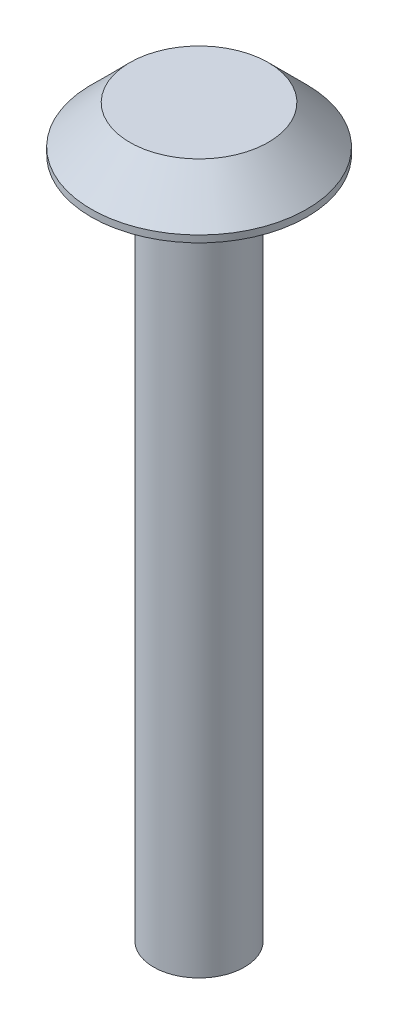
ISO-10303-21;
HEADER;
FILE_DESCRIPTION(('STEP AP214'),'2;1');
FILE_NAME('part.step','',(''),(''),'','','');
FILE_SCHEMA(('AUTOMOTIVE_DESIGN { 1 0 10303 214 1 1 1 1 }'));
ENDSEC;
DATA;
#1=APPLICATION_CONTEXT('core data for automotive mechanical design processes');
#2=APPLICATION_PROTOCOL_DEFINITION('international standard','automotive_design',2000,#1);
#3=PRODUCT_CONTEXT('',#1,'mechanical');
#4=PRODUCT('Part','Part','',(#3));
#5=PRODUCT_RELATED_PRODUCT_CATEGORY('part','',(#4));
#6=PRODUCT_DEFINITION_FORMATION('','',#4);
#7=PRODUCT_DEFINITION_CONTEXT('part definition',#1,'design');
#8=PRODUCT_DEFINITION('design','',#6,#7);
#9=PRODUCT_DEFINITION_SHAPE('','',#8);
#10=(LENGTH_UNIT() NAMED_UNIT(*) SI_UNIT(.MILLI.,.METRE.));
#11=(NAMED_UNIT(*) PLANE_ANGLE_UNIT() SI_UNIT($,.RADIAN.));
#12=(NAMED_UNIT(*) SI_UNIT($,.STERADIAN.) SOLID_ANGLE_UNIT());
#13=UNCERTAINTY_MEASURE_WITH_UNIT(LENGTH_MEASURE(1.E-05),#10,'distance_accuracy_value','');
#14=(GEOMETRIC_REPRESENTATION_CONTEXT(3) GLOBAL_UNCERTAINTY_ASSIGNED_CONTEXT((#13)) GLOBAL_UNIT_ASSIGNED_CONTEXT((#10,
#11,#12)) REPRESENTATION_CONTEXT('',''));
#15=CARTESIAN_POINT('',(0.,0.,0.));
#16=DIRECTION('',(0.,0.,1.));
#17=DIRECTION('',(1.,0.,0.));
#18=AXIS2_PLACEMENT_3D('',#15,#16,#17);
#19=CARTESIAN_POINT('',(0.,30.,0.));
#20=DIRECTION('',(0.,-1.,0.));
#21=DIRECTION('',(0.,0.,-1.));
#22=AXIS2_PLACEMENT_3D('',#19,#20,#21);
#23=CYLINDRICAL_SURFACE('',#22,2.);
#24=CARTESIAN_POINT('',(0.,30.,0.));
#25=DIRECTION('',(0.,1.,0.));
#26=DIRECTION('',(0.,0.,1.));
#27=AXIS2_PLACEMENT_3D('',#24,#25,#26);
#28=CIRCLE('',#27,2.);
#29=CARTESIAN_POINT('',(0.,30.,2.));
#30=VERTEX_POINT('',#29);
#31=EDGE_CURVE('E46',#30,#30,#28,.T.);
#32=ORIENTED_EDGE('',*,*,#31,.F.);
#33=EDGE_LOOP('',(#32));
#34=FACE_BOUND('',#33,.T.);
#35=CARTESIAN_POINT('',(0.,0.,0.));
#36=DIRECTION('',(0.,1.,0.));
#37=DIRECTION('',(0.,0.,1.));
#38=AXIS2_PLACEMENT_3D('',#35,#36,#37);
#39=CIRCLE('',#38,2.);
#40=CARTESIAN_POINT('',(0.,0.,2.));
#41=VERTEX_POINT('',#40);
#42=EDGE_CURVE('E50',#41,#41,#39,.T.);
#43=ORIENTED_EDGE('',*,*,#42,.T.);
#44=EDGE_LOOP('',(#43));
#45=FACE_BOUND('',#44,.T.);
#46=ADVANCED_FACE('F35',(#34,#45),#23,.T.);
#47=CARTESIAN_POINT('',(0.,0.,0.));
#48=DIRECTION('',(0.,1.,0.));
#49=DIRECTION('',(0.,0.,1.));
#50=AXIS2_PLACEMENT_3D('',#47,#48,#49);
#51=PLANE('',#50);
#52=ORIENTED_EDGE('',*,*,#42,.F.);
#53=EDGE_LOOP('',(#52));
#54=FACE_BOUND('',#53,.T.);
#55=ADVANCED_FACE('F74',(#54),#51,.F.);
#56=CARTESIAN_POINT('',(0.,32.,0.));
#57=DIRECTION('',(0.,-1.,0.));
#58=DIRECTION('',(0.,0.,-1.));
#59=AXIS2_PLACEMENT_3D('',#56,#57,#58);
#60=CYLINDRICAL_SURFACE('',#59,4.75);
#61=CARTESIAN_POINT('',(0.,30.3,0.));
#62=DIRECTION('',(0.,1.,0.));
#63=DIRECTION('',(0.,0.,1.));
#64=AXIS2_PLACEMENT_3D('',#61,#62,#63);
#65=CIRCLE('',#64,4.75);
#66=CARTESIAN_POINT('',(0.,30.3,-4.75));
#67=VERTEX_POINT('',#66);
#68=EDGE_CURVE('E10',#67,#67,#65,.F.);
#69=ORIENTED_EDGE('',*,*,#68,.T.);
#70=EDGE_LOOP('',(#69));
#71=FACE_BOUND('',#70,.T.);
#72=CARTESIAN_POINT('',(0.,30.,0.));
#73=DIRECTION('',(0.,1.,0.));
#74=DIRECTION('',(0.,0.,1.));
#75=AXIS2_PLACEMENT_3D('',#72,#73,#74);
#76=CIRCLE('',#75,4.75);
#77=CARTESIAN_POINT('',(0.,30.,4.75));
#78=VERTEX_POINT('',#77);
#79=EDGE_CURVE('E54',#78,#78,#76,.T.);
#80=ORIENTED_EDGE('',*,*,#79,.T.);
#81=EDGE_LOOP('',(#80));
#82=FACE_BOUND('',#81,.T.);
#83=ADVANCED_FACE('F59',(#71,#82),#60,.T.);
#84=CARTESIAN_POINT('',(0.,32.,0.));
#85=DIRECTION('',(0.,1.,0.));
#86=DIRECTION('',(0.,0.,1.));
#87=AXIS2_PLACEMENT_3D('',#84,#85,#86);
#88=PLANE('',#87);
#89=CARTESIAN_POINT('',(0.,32.,0.));
#90=DIRECTION('',(0.,1.,0.));
#91=DIRECTION('',(0.,0.,1.));
#92=AXIS2_PLACEMENT_3D('',#89,#90,#91);
#93=CIRCLE('',#92,3.05);
#94=CARTESIAN_POINT('',(0.,32.,-3.05000000000001));
#95=VERTEX_POINT('',#94);
#96=EDGE_CURVE('E42',#95,#95,#93,.T.);
#97=ORIENTED_EDGE('',*,*,#96,.T.);
#98=EDGE_LOOP('',(#97));
#99=FACE_BOUND('',#98,.T.);
#100=ADVANCED_FACE('F63',(#99),#88,.T.);
#101=CARTESIAN_POINT('',(0.,30.,0.));
#102=DIRECTION('',(0.,1.,0.));
#103=DIRECTION('',(0.,0.,1.));
#104=AXIS2_PLACEMENT_3D('',#101,#102,#103);
#105=PLANE('',#104);
#106=ORIENTED_EDGE('',*,*,#31,.T.);
#107=EDGE_LOOP('',(#106));
#108=FACE_BOUND('',#107,.T.);
#109=ORIENTED_EDGE('',*,*,#79,.F.);
#110=EDGE_LOOP('',(#109));
#111=FACE_BOUND('',#110,.T.);
#112=ADVANCED_FACE('F61',(#108,#111),#105,.F.);
#113=CARTESIAN_POINT('',(0.,32.,0.));
#114=DIRECTION('',(0.,-1.,0.));
#115=DIRECTION('',(0.,0.,-1.));
#116=AXIS2_PLACEMENT_3D('',#113,#114,#115);
#117=CONICAL_SURFACE('',#116,3.05,0.785398163397445);
#118=CARTESIAN_POINT('',(0.,30.3,-4.75));
#119=CARTESIAN_POINT('',(0.,30.3177083333333,-4.73229166666667));
#120=CARTESIAN_POINT('',(0.,30.3354166666667,-4.71458333333334));
#121=CARTESIAN_POINT('',(0.,30.3708333333333,-4.67916666666667));
#122=CARTESIAN_POINT('',(0.,30.3885416666667,-4.66145833333333));
#123=CARTESIAN_POINT('',(0.,30.4239583333333,-4.62604166666667));
#124=CARTESIAN_POINT('',(0.,30.4416666666667,-4.60833333333334));
#125=CARTESIAN_POINT('',(0.,30.4770833333333,-4.57291666666667));
#126=CARTESIAN_POINT('',(0.,30.4947916666667,-4.55520833333334));
#127=CARTESIAN_POINT('',(0.,30.5302083333333,-4.51979166666667));
#128=CARTESIAN_POINT('',(0.,30.5479166666667,-4.50208333333334));
#129=CARTESIAN_POINT('',(0.,30.5833333333333,-4.46666666666667));
#130=CARTESIAN_POINT('',(0.,30.6010416666667,-4.44895833333334));
#131=CARTESIAN_POINT('',(0.,30.6364583333333,-4.41354166666667));
#132=CARTESIAN_POINT('',(0.,30.6541666666667,-4.39583333333334));
#133=CARTESIAN_POINT('',(0.,30.6895833333333,-4.36041666666667));
#134=CARTESIAN_POINT('',(0.,30.7072916666667,-4.34270833333334));
#135=CARTESIAN_POINT('',(0.,30.7427083333333,-4.30729166666667));
#136=CARTESIAN_POINT('',(0.,30.7604166666667,-4.28958333333334));
#137=CARTESIAN_POINT('',(0.,30.7958333333333,-4.25416666666667));
#138=CARTESIAN_POINT('',(0.,30.8135416666667,-4.23645833333334));
#139=CARTESIAN_POINT('',(0.,30.8489583333333,-4.20104166666667));
#140=CARTESIAN_POINT('',(0.,30.8666666666667,-4.18333333333334));
#141=CARTESIAN_POINT('',(0.,30.9020833333333,-4.14791666666667));
#142=CARTESIAN_POINT('',(0.,30.9197916666667,-4.13020833333334));
#143=CARTESIAN_POINT('',(0.,30.9552083333333,-4.09479166666667));
#144=CARTESIAN_POINT('',(0.,30.9729166666667,-4.07708333333334));
#145=CARTESIAN_POINT('',(0.,31.0083333333333,-4.04166666666667));
#146=CARTESIAN_POINT('',(0.,31.0260416666667,-4.02395833333334));
#147=CARTESIAN_POINT('',(0.,31.0614583333333,-3.98854166666667));
#148=CARTESIAN_POINT('',(0.,31.0791666666667,-3.97083333333334));
#149=CARTESIAN_POINT('',(0.,31.1145833333333,-3.93541666666667));
#150=CARTESIAN_POINT('',(0.,31.1322916666667,-3.91770833333334));
#151=CARTESIAN_POINT('',(0.,31.1677083333333,-3.88229166666667));
#152=CARTESIAN_POINT('',(0.,31.1854166666667,-3.86458333333334));
#153=CARTESIAN_POINT('',(0.,31.2208333333333,-3.82916666666667));
#154=CARTESIAN_POINT('',(0.,31.2385416666667,-3.81145833333334));
#155=CARTESIAN_POINT('',(0.,31.2739583333333,-3.77604166666667));
#156=CARTESIAN_POINT('',(0.,31.2916666666667,-3.75833333333334));
#157=CARTESIAN_POINT('',(0.,31.3270833333333,-3.72291666666667));
#158=CARTESIAN_POINT('',(0.,31.3447916666667,-3.70520833333334));
#159=CARTESIAN_POINT('',(0.,31.3802083333333,-3.66979166666667));
#160=CARTESIAN_POINT('',(0.,31.3979166666667,-3.65208333333334));
#161=CARTESIAN_POINT('',(0.,31.4333333333333,-3.61666666666667));
#162=CARTESIAN_POINT('',(0.,31.4510416666667,-3.59895833333334));
#163=CARTESIAN_POINT('',(0.,31.4864583333333,-3.56354166666667));
#164=CARTESIAN_POINT('',(0.,31.5041666666667,-3.54583333333334));
#165=CARTESIAN_POINT('',(0.,31.5395833333333,-3.51041666666667));
#166=CARTESIAN_POINT('',(0.,31.5572916666667,-3.49270833333334));
#167=CARTESIAN_POINT('',(0.,31.5927083333333,-3.45729166666667));
#168=CARTESIAN_POINT('',(0.,31.6104166666667,-3.43958333333334));
#169=CARTESIAN_POINT('',(0.,31.6458333333333,-3.40416666666667));
#170=CARTESIAN_POINT('',(0.,31.6635416666667,-3.38645833333334));
#171=CARTESIAN_POINT('',(0.,31.6989583333333,-3.35104166666667));
#172=CARTESIAN_POINT('',(0.,31.7166666666667,-3.33333333333334));
#173=CARTESIAN_POINT('',(0.,31.7520833333333,-3.29791666666667));
#174=CARTESIAN_POINT('',(0.,31.7697916666667,-3.28020833333334));
#175=CARTESIAN_POINT('',(0.,31.8052083333333,-3.24479166666667));
#176=CARTESIAN_POINT('',(0.,31.8229166666667,-3.22708333333334));
#177=CARTESIAN_POINT('',(0.,31.8583333333333,-3.19166666666667));
#178=CARTESIAN_POINT('',(0.,31.8760416666667,-3.17395833333334));
#179=CARTESIAN_POINT('',(0.,31.9114583333333,-3.13854166666667));
#180=CARTESIAN_POINT('',(0.,31.9291666666667,-3.12083333333334));
#181=CARTESIAN_POINT('',(0.,31.9645833333333,-3.08541666666667));
#182=CARTESIAN_POINT('',(0.,31.9822916666667,-3.06770833333334));
#183=CARTESIAN_POINT('',(0.,32.,-3.05000000000001));
#184=B_SPLINE_CURVE_WITH_KNOTS('',3,(#118,#119,#120,#121,#122,#123,#124,#125,#126,#127,#128,
#129,#130,#131,#132,#133,#134,#135,#136,#137,#138,#139,#140,#141,#142,#143,#144,#145,#146,#147,
#148,#149,#150,#151,#152,#153,#154,#155,#156,#157,#158,#159,#160,#161,#162,#163,#164,#165,#166,
#167,#168,#169,#170,#171,#172,#173,#174,#175,#176,#177,#178,#179,#180,#181,#182,#183),
.UNSPECIFIED.,.F.,.F.,(4,2,2,2,2,2,2,2,2,2,2,2,2,2,2,2,2,2,2,2,2,2,2,2,2,2,2,2,2,2,2,2,4),(0.,
0.0751300955010716,0.150260191002143,0.225390286503214,0.300520382004283,0.375650477505354,
0.450780573006426,0.525910668507497,0.601040764008566,0.676170859509637,0.751300955010709,
0.82643105051178,0.901561146012849,0.97669124151392,1.05182133701499,1.12695143251606,
1.20208152801713,1.2772116235182,1.35234171901927,1.42747181452034,1.50260191002141,
1.57773200552249,1.65286210102356,1.72799219652463,1.8031222920257,1.87825238752677,
1.95338248302784,2.02851257852891,2.10364267402998,2.17877276953105,2.25390286503212,
2.32903296053319,2.40416305603426),.UNSPECIFIED.);
#185=EDGE_CURVE('BSEAM37',#67,#95,#184,.T.);
#186=ORIENTED_EDGE('',*,*,#68,.F.);
#187=ORIENTED_EDGE('',*,*,#96,.F.);
#188=ORIENTED_EDGE('',*,*,#185,.T.);
#189=ORIENTED_EDGE('',*,*,#185,.F.);
#190=EDGE_LOOP('',(#186,#188,#187,#189));
#191=FACE_BOUND('',#190,.T.);
#192=ADVANCED_FACE('F37',(#191),#117,.T.);
#193=CLOSED_SHELL('',(#46,#55,#83,#100,#112,#192));
#194=MANIFOLD_SOLID_BREP('B2',#193);
#195=ADVANCED_BREP_SHAPE_REPRESENTATION('',(#18,#194),#14);
#196=SHAPE_DEFINITION_REPRESENTATION(#9,#195);
ENDSEC;
END-ISO-10303-21;
